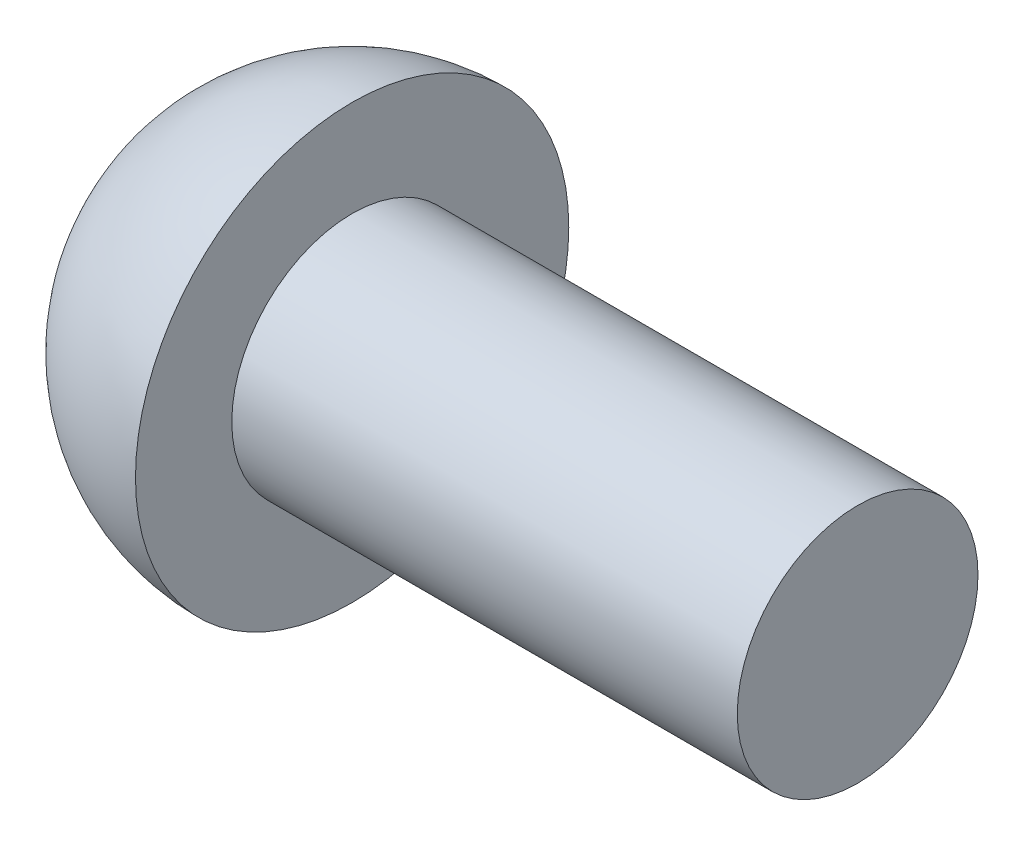
ISO-10303-21;
HEADER;
FILE_DESCRIPTION(('STEP AP214'),'2;1');
FILE_NAME('part.step','',(''),(''),'','','');
FILE_SCHEMA(('AUTOMOTIVE_DESIGN { 1 0 10303 214 1 1 1 1 }'));
ENDSEC;
DATA;
#1=APPLICATION_CONTEXT('core data for automotive mechanical design processes');
#2=APPLICATION_PROTOCOL_DEFINITION('international standard','automotive_design',2000,#1);
#3=PRODUCT_CONTEXT('',#1,'mechanical');
#4=PRODUCT('Part','Part','',(#3));
#5=PRODUCT_RELATED_PRODUCT_CATEGORY('part','',(#4));
#6=PRODUCT_DEFINITION_FORMATION('','',#4);
#7=PRODUCT_DEFINITION_CONTEXT('part definition',#1,'design');
#8=PRODUCT_DEFINITION('design','',#6,#7);
#9=PRODUCT_DEFINITION_SHAPE('','',#8);
#10=(LENGTH_UNIT() NAMED_UNIT(*) SI_UNIT(.MILLI.,.METRE.));
#11=(NAMED_UNIT(*) PLANE_ANGLE_UNIT() SI_UNIT($,.RADIAN.));
#12=(NAMED_UNIT(*) SI_UNIT($,.STERADIAN.) SOLID_ANGLE_UNIT());
#13=UNCERTAINTY_MEASURE_WITH_UNIT(LENGTH_MEASURE(1.E-05),#10,'distance_accuracy_value','');
#14=(GEOMETRIC_REPRESENTATION_CONTEXT(3) GLOBAL_UNCERTAINTY_ASSIGNED_CONTEXT((#13)) GLOBAL_UNIT_ASSIGNED_CONTEXT((#10,
#11,#12)) REPRESENTATION_CONTEXT('',''));
#15=CARTESIAN_POINT('',(0.,0.,0.));
#16=DIRECTION('',(0.,0.,1.));
#17=DIRECTION('',(1.,0.,0.));
#18=AXIS2_PLACEMENT_3D('',#15,#16,#17);
#19=CARTESIAN_POINT('',(0.,5.,0.));
#20=DIRECTION('',(1.,0.,0.));
#21=DIRECTION('',(0.,1.,0.));
#22=AXIS2_PLACEMENT_3D('',#19,#20,#21);
#23=PLANE('',#22);
#24=CARTESIAN_POINT('',(0.,0.,0.));
#25=DIRECTION('',(1.,0.,0.));
#26=DIRECTION('',(0.,1.,0.));
#27=AXIS2_PLACEMENT_3D('',#24,#25,#26);
#28=CIRCLE('',#27,5.);
#29=CARTESIAN_POINT('',(0.,5.,0.));
#30=VERTEX_POINT('',#29);
#31=EDGE_CURVE('E59',#30,#30,#28,.T.);
#32=ORIENTED_EDGE('',*,*,#31,.T.);
#33=EDGE_LOOP('',(#32));
#34=FACE_BOUND('',#33,.T.);
#35=ADVANCED_FACE('F47',(#34),#23,.T.);
#36=CARTESIAN_POINT('',(-21.,0.,0.));
#37=DIRECTION('',(1.,0.,0.));
#38=DIRECTION('',(0.,1.,0.));
#39=AXIS2_PLACEMENT_3D('',#36,#37,#38);
#40=SPHERICAL_SURFACE('',#39,9.);
#41=CARTESIAN_POINT('',(-21.,0.,0.));
#42=DIRECTION('',(1.,0.,0.));
#43=DIRECTION('',(0.,1.,0.));
#44=AXIS2_PLACEMENT_3D('',#41,#42,#43);
#45=CIRCLE('',#44,9.);
#46=CARTESIAN_POINT('',(-21.,9.,0.));
#47=VERTEX_POINT('',#46);
#48=EDGE_CURVE('E10',#47,#47,#45,.T.);
#49=ORIENTED_EDGE('',*,*,#48,.F.);
#50=EDGE_LOOP('',(#49));
#51=FACE_BOUND('',#50,.T.);
#52=ADVANCED_FACE('F75',(#51),#40,.T.);
#53=CARTESIAN_POINT('',(-21.,9.,0.));
#54=DIRECTION('',(1.,0.,0.));
#55=DIRECTION('',(0.,1.,0.));
#56=AXIS2_PLACEMENT_3D('',#53,#54,#55);
#57=PLANE('',#56);
#58=ORIENTED_EDGE('',*,*,#48,.T.);
#59=EDGE_LOOP('',(#58));
#60=FACE_BOUND('',#59,.T.);
#61=CARTESIAN_POINT('',(-21.,0.,0.));
#62=DIRECTION('',(1.,0.,0.));
#63=DIRECTION('',(0.,1.,0.));
#64=AXIS2_PLACEMENT_3D('',#61,#62,#63);
#65=CIRCLE('',#64,5.);
#66=CARTESIAN_POINT('',(-21.,5.,0.));
#67=VERTEX_POINT('',#66);
#68=EDGE_CURVE('E54',#67,#67,#65,.T.);
#69=ORIENTED_EDGE('',*,*,#68,.F.);
#70=EDGE_LOOP('',(#69));
#71=FACE_BOUND('',#70,.T.);
#72=ADVANCED_FACE('F70',(#60,#71),#57,.T.);
#73=CARTESIAN_POINT('',(0.,0.,0.));
#74=DIRECTION('',(1.,0.,0.));
#75=DIRECTION('',(0.,1.,0.));
#76=AXIS2_PLACEMENT_3D('',#73,#74,#75);
#77=CYLINDRICAL_SURFACE('',#76,5.);
#78=ORIENTED_EDGE('',*,*,#68,.T.);
#79=EDGE_LOOP('',(#78));
#80=FACE_BOUND('',#79,.T.);
#81=ORIENTED_EDGE('',*,*,#31,.F.);
#82=EDGE_LOOP('',(#81));
#83=FACE_BOUND('',#82,.T.);
#84=ADVANCED_FACE('F68',(#80,#83),#77,.T.);
#85=CLOSED_SHELL('',(#35,#52,#72,#84));
#86=MANIFOLD_SOLID_BREP('B2',#85);
#87=ADVANCED_BREP_SHAPE_REPRESENTATION('',(#18,#86),#14);
#88=SHAPE_DEFINITION_REPRESENTATION(#9,#87);
ENDSEC;
END-ISO-10303-21;
